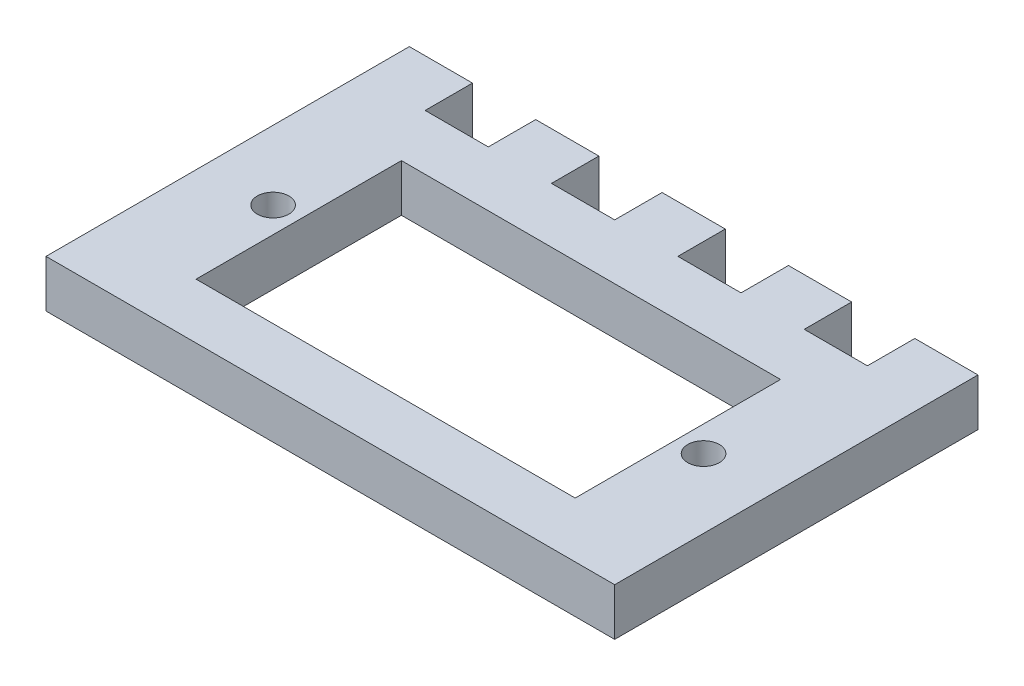
ISO-10303-21;
HEADER;
FILE_DESCRIPTION(('STEP AP214'),'2;1');
FILE_NAME('part.step','',(''),(''),'','','');
FILE_SCHEMA(('AUTOMOTIVE_DESIGN { 1 0 10303 214 1 1 1 1 }'));
ENDSEC;
DATA;
#1=APPLICATION_CONTEXT('core data for automotive mechanical design processes');
#2=APPLICATION_PROTOCOL_DEFINITION('international standard','automotive_design',2000,#1);
#3=PRODUCT_CONTEXT('',#1,'mechanical');
#4=PRODUCT('Part','Part','',(#3));
#5=PRODUCT_RELATED_PRODUCT_CATEGORY('part','',(#4));
#6=PRODUCT_DEFINITION_FORMATION('','',#4);
#7=PRODUCT_DEFINITION_CONTEXT('part definition',#1,'design');
#8=PRODUCT_DEFINITION('design','',#6,#7);
#9=PRODUCT_DEFINITION_SHAPE('','',#8);
#10=(LENGTH_UNIT() NAMED_UNIT(*) SI_UNIT(.MILLI.,.METRE.));
#11=(NAMED_UNIT(*) PLANE_ANGLE_UNIT() SI_UNIT($,.RADIAN.));
#12=(NAMED_UNIT(*) SI_UNIT($,.STERADIAN.) SOLID_ANGLE_UNIT());
#13=UNCERTAINTY_MEASURE_WITH_UNIT(LENGTH_MEASURE(1.E-05),#10,'distance_accuracy_value','');
#14=(GEOMETRIC_REPRESENTATION_CONTEXT(3) GLOBAL_UNCERTAINTY_ASSIGNED_CONTEXT((#13)) GLOBAL_UNIT_ASSIGNED_CONTEXT((#10,
#11,#12)) REPRESENTATION_CONTEXT('',''));
#15=CARTESIAN_POINT('',(0.,0.,0.));
#16=DIRECTION('',(0.,0.,1.));
#17=DIRECTION('',(1.,0.,0.));
#18=AXIS2_PLACEMENT_3D('',#15,#16,#17);
#19=CARTESIAN_POINT('',(0.,3.,0.));
#20=DIRECTION('',(0.,1.,0.));
#21=DIRECTION('',(0.,0.,1.));
#22=AXIS2_PLACEMENT_3D('',#19,#20,#21);
#23=PLANE('',#22);
#24=CARTESIAN_POINT('',(-13.625,3.,0.));
#25=DIRECTION('',(0.,1.,0.));
#26=DIRECTION('',(0.,0.,1.));
#27=AXIS2_PLACEMENT_3D('',#24,#25,#26);
#28=CIRCLE('',#27,1.);
#29=CARTESIAN_POINT('',(-13.625,3.,1.));
#30=VERTEX_POINT('',#29);
#31=EDGE_CURVE('E225',#30,#30,#28,.T.);
#32=ORIENTED_EDGE('',*,*,#31,.F.);
#33=EDGE_LOOP('',(#32));
#34=FACE_BOUND('',#33,.T.);
#35=DIRECTION('',(0.,0.,-1.));
#36=VECTOR('',#35,1.);
#37=CARTESIAN_POINT('',(18.,3.,-13.));
#38=LINE('',#37,#36);
#39=CARTESIAN_POINT('',(18.,3.,10.));
#40=VERTEX_POINT('',#39);
#41=CARTESIAN_POINT('',(18.,3.,-13.));
#42=VERTEX_POINT('',#41);
#43=EDGE_CURVE('E235',#40,#42,#38,.T.);
#44=ORIENTED_EDGE('',*,*,#43,.T.);
#45=DIRECTION('',(-1.,0.,0.));
#46=VECTOR('',#45,1.);
#47=CARTESIAN_POINT('',(14.,3.,-13.));
#48=LINE('',#47,#46);
#49=CARTESIAN_POINT('',(14.,3.,-13.));
#50=VERTEX_POINT('',#49);
#51=EDGE_CURVE('E238',#42,#50,#48,.T.);
#52=ORIENTED_EDGE('',*,*,#51,.T.);
#53=DIRECTION('',(0.,0.,1.));
#54=VECTOR('',#53,1.);
#55=CARTESIAN_POINT('',(14.,3.,-10.));
#56=LINE('',#55,#54);
#57=CARTESIAN_POINT('',(14.,3.,-10.));
#58=VERTEX_POINT('',#57);
#59=EDGE_CURVE('E241',#50,#58,#56,.T.);
#60=ORIENTED_EDGE('',*,*,#59,.T.);
#61=DIRECTION('',(-1.,0.,0.));
#62=VECTOR('',#61,1.);
#63=CARTESIAN_POINT('',(10.,3.,-10.));
#64=LINE('',#63,#62);
#65=CARTESIAN_POINT('',(10.,3.,-10.));
#66=VERTEX_POINT('',#65);
#67=EDGE_CURVE('E243',#58,#66,#64,.T.);
#68=ORIENTED_EDGE('',*,*,#67,.T.);
#69=DIRECTION('',(0.,0.,-1.));
#70=VECTOR('',#69,1.);
#71=CARTESIAN_POINT('',(10.,3.,-13.));
#72=LINE('',#71,#70);
#73=CARTESIAN_POINT('',(10.,3.,-13.));
#74=VERTEX_POINT('',#73);
#75=EDGE_CURVE('E245',#66,#74,#72,.T.);
#76=ORIENTED_EDGE('',*,*,#75,.T.);
#77=DIRECTION('',(-1.,0.,0.));
#78=VECTOR('',#77,1.);
#79=CARTESIAN_POINT('',(6.,3.,-13.));
#80=LINE('',#79,#78);
#81=CARTESIAN_POINT('',(6.,3.,-13.));
#82=VERTEX_POINT('',#81);
#83=EDGE_CURVE('E247',#74,#82,#80,.T.);
#84=ORIENTED_EDGE('',*,*,#83,.T.);
#85=DIRECTION('',(0.,0.,1.));
#86=VECTOR('',#85,1.);
#87=CARTESIAN_POINT('',(6.,3.,-10.));
#88=LINE('',#87,#86);
#89=CARTESIAN_POINT('',(6.,3.,-10.));
#90=VERTEX_POINT('',#89);
#91=EDGE_CURVE('E249',#82,#90,#88,.T.);
#92=ORIENTED_EDGE('',*,*,#91,.T.);
#93=DIRECTION('',(-1.,0.,0.));
#94=VECTOR('',#93,1.);
#95=CARTESIAN_POINT('',(2.,3.,-10.));
#96=LINE('',#95,#94);
#97=CARTESIAN_POINT('',(2.,3.,-10.));
#98=VERTEX_POINT('',#97);
#99=EDGE_CURVE('E251',#90,#98,#96,.T.);
#100=ORIENTED_EDGE('',*,*,#99,.T.);
#101=DIRECTION('',(0.,0.,-1.));
#102=VECTOR('',#101,1.);
#103=CARTESIAN_POINT('',(2.,3.,-13.));
#104=LINE('',#103,#102);
#105=CARTESIAN_POINT('',(2.,3.,-13.));
#106=VERTEX_POINT('',#105);
#107=EDGE_CURVE('E253',#98,#106,#104,.T.);
#108=ORIENTED_EDGE('',*,*,#107,.T.);
#109=DIRECTION('',(-1.,0.,0.));
#110=VECTOR('',#109,1.);
#111=CARTESIAN_POINT('',(-2.,3.,-13.));
#112=LINE('',#111,#110);
#113=CARTESIAN_POINT('',(-2.,3.,-13.));
#114=VERTEX_POINT('',#113);
#115=EDGE_CURVE('E255',#106,#114,#112,.T.);
#116=ORIENTED_EDGE('',*,*,#115,.T.);
#117=DIRECTION('',(0.,0.,1.));
#118=VECTOR('',#117,1.);
#119=CARTESIAN_POINT('',(-2.,3.,-10.));
#120=LINE('',#119,#118);
#121=CARTESIAN_POINT('',(-2.,3.,-10.));
#122=VERTEX_POINT('',#121);
#123=EDGE_CURVE('E257',#114,#122,#120,.T.);
#124=ORIENTED_EDGE('',*,*,#123,.T.);
#125=DIRECTION('',(-1.,0.,0.));
#126=VECTOR('',#125,1.);
#127=CARTESIAN_POINT('',(-6.,3.,-10.));
#128=LINE('',#127,#126);
#129=CARTESIAN_POINT('',(-6.,3.,-10.));
#130=VERTEX_POINT('',#129);
#131=EDGE_CURVE('E259',#122,#130,#128,.T.);
#132=ORIENTED_EDGE('',*,*,#131,.T.);
#133=DIRECTION('',(0.,0.,-1.));
#134=VECTOR('',#133,1.);
#135=CARTESIAN_POINT('',(-6.,3.,-13.));
#136=LINE('',#135,#134);
#137=CARTESIAN_POINT('',(-6.,3.,-13.));
#138=VERTEX_POINT('',#137);
#139=EDGE_CURVE('E261',#130,#138,#136,.T.);
#140=ORIENTED_EDGE('',*,*,#139,.T.);
#141=DIRECTION('',(-1.,0.,0.));
#142=VECTOR('',#141,1.);
#143=CARTESIAN_POINT('',(-9.99999999999999,3.,-13.));
#144=LINE('',#143,#142);
#145=CARTESIAN_POINT('',(-9.99999999999999,3.,-13.));
#146=VERTEX_POINT('',#145);
#147=EDGE_CURVE('E263',#138,#146,#144,.T.);
#148=ORIENTED_EDGE('',*,*,#147,.T.);
#149=DIRECTION('',(0.,0.,1.));
#150=VECTOR('',#149,1.);
#151=CARTESIAN_POINT('',(-9.99999999999999,3.,-10.));
#152=LINE('',#151,#150);
#153=CARTESIAN_POINT('',(-9.99999999999999,3.,-10.));
#154=VERTEX_POINT('',#153);
#155=EDGE_CURVE('E265',#146,#154,#152,.T.);
#156=ORIENTED_EDGE('',*,*,#155,.T.);
#157=DIRECTION('',(-1.,0.,0.));
#158=VECTOR('',#157,1.);
#159=CARTESIAN_POINT('',(-14.,3.,-10.));
#160=LINE('',#159,#158);
#161=CARTESIAN_POINT('',(-14.,3.,-10.));
#162=VERTEX_POINT('',#161);
#163=EDGE_CURVE('E267',#154,#162,#160,.T.);
#164=ORIENTED_EDGE('',*,*,#163,.T.);
#165=DIRECTION('',(0.,0.,-1.));
#166=VECTOR('',#165,1.);
#167=CARTESIAN_POINT('',(-14.,3.,-13.));
#168=LINE('',#167,#166);
#169=CARTESIAN_POINT('',(-14.,3.,-13.));
#170=VERTEX_POINT('',#169);
#171=EDGE_CURVE('E269',#162,#170,#168,.T.);
#172=ORIENTED_EDGE('',*,*,#171,.T.);
#173=DIRECTION('',(-1.,0.,0.));
#174=VECTOR('',#173,1.);
#175=CARTESIAN_POINT('',(-18.,3.,-13.));
#176=LINE('',#175,#174);
#177=CARTESIAN_POINT('',(-18.,3.,-13.));
#178=VERTEX_POINT('',#177);
#179=EDGE_CURVE('E271',#170,#178,#176,.T.);
#180=ORIENTED_EDGE('',*,*,#179,.T.);
#181=DIRECTION('',(0.,0.,1.));
#182=VECTOR('',#181,1.);
#183=CARTESIAN_POINT('',(-18.,3.,-10.));
#184=LINE('',#183,#182);
#185=CARTESIAN_POINT('',(-18.,3.,10.));
#186=VERTEX_POINT('',#185);
#187=EDGE_CURVE('E273',#178,#186,#184,.T.);
#188=ORIENTED_EDGE('',*,*,#187,.T.);
#189=DIRECTION('',(1.,0.,0.));
#190=VECTOR('',#189,1.);
#191=CARTESIAN_POINT('',(-18.,3.,10.));
#192=LINE('',#191,#190);
#193=EDGE_CURVE('E275',#186,#40,#192,.T.);
#194=ORIENTED_EDGE('',*,*,#193,.T.);
#195=EDGE_LOOP('',(#44,#52,#60,#68,#76,#84,#92,#100,#108,#116,#124,#132,#140,#148,#156,#164,
#172,#180,#188,#194));
#196=FACE_BOUND('',#195,.T.);
#197=DIRECTION('',(-1.,0.,0.));
#198=VECTOR('',#197,1.);
#199=CARTESIAN_POINT('',(-12.,3.,-6.5));
#200=LINE('',#199,#198);
#201=CARTESIAN_POINT('',(12.,3.,-6.5));
#202=VERTEX_POINT('',#201);
#203=CARTESIAN_POINT('',(-12.,3.,-6.5));
#204=VERTEX_POINT('',#203);
#205=EDGE_CURVE('E204',#202,#204,#200,.T.);
#206=ORIENTED_EDGE('',*,*,#205,.F.);
#207=DIRECTION('',(0.,0.,-1.));
#208=VECTOR('',#207,1.);
#209=CARTESIAN_POINT('',(12.,3.,6.5));
#210=LINE('',#209,#208);
#211=CARTESIAN_POINT('',(12.,3.,6.5));
#212=VERTEX_POINT('',#211);
#213=EDGE_CURVE('E196',#212,#202,#210,.T.);
#214=ORIENTED_EDGE('',*,*,#213,.F.);
#215=DIRECTION('',(1.,0.,0.));
#216=VECTOR('',#215,1.);
#217=CARTESIAN_POINT('',(-12.,3.,6.5));
#218=LINE('',#217,#216);
#219=CARTESIAN_POINT('',(-12.,3.,6.5));
#220=VERTEX_POINT('',#219);
#221=EDGE_CURVE('E219',#220,#212,#218,.T.);
#222=ORIENTED_EDGE('',*,*,#221,.F.);
#223=DIRECTION('',(0.,0.,1.));
#224=VECTOR('',#223,1.);
#225=CARTESIAN_POINT('',(-12.,3.,6.5));
#226=LINE('',#225,#224);
#227=EDGE_CURVE('E217',#204,#220,#226,.T.);
#228=ORIENTED_EDGE('',*,*,#227,.F.);
#229=EDGE_LOOP('',(#206,#214,#222,#228));
#230=FACE_BOUND('',#229,.T.);
#231=CARTESIAN_POINT('',(13.625,3.,0.));
#232=DIRECTION('',(0.,1.,0.));
#233=DIRECTION('',(0.,0.,-1.));
#234=AXIS2_PLACEMENT_3D('',#231,#232,#233);
#235=CIRCLE('',#234,1.);
#236=CARTESIAN_POINT('',(13.625,3.,-1.));
#237=VERTEX_POINT('',#236);
#238=EDGE_CURVE('E712',#237,#237,#235,.T.);
#239=ORIENTED_EDGE('',*,*,#238,.F.);
#240=EDGE_LOOP('',(#239));
#241=FACE_BOUND('',#240,.T.);
#242=ADVANCED_FACE('F35',(#34,#196,#230,#241),#23,.T.);
#243=CARTESIAN_POINT('',(0.,0.,0.));
#244=DIRECTION('',(0.,1.,0.));
#245=DIRECTION('',(0.,0.,1.));
#246=AXIS2_PLACEMENT_3D('',#243,#244,#245);
#247=PLANE('',#246);
#248=CARTESIAN_POINT('',(-13.625,0.,0.));
#249=DIRECTION('',(0.,1.,0.));
#250=DIRECTION('',(0.,0.,1.));
#251=AXIS2_PLACEMENT_3D('',#248,#249,#250);
#252=CIRCLE('',#251,1.);
#253=CARTESIAN_POINT('',(-13.625,0.,1.));
#254=VERTEX_POINT('',#253);
#255=EDGE_CURVE('E718',#254,#254,#252,.T.);
#256=ORIENTED_EDGE('',*,*,#255,.T.);
#257=EDGE_LOOP('',(#256));
#258=FACE_BOUND('',#257,.T.);
#259=DIRECTION('',(-1.,0.,0.));
#260=VECTOR('',#259,1.);
#261=CARTESIAN_POINT('',(14.,0.,-13.));
#262=LINE('',#261,#260);
#263=CARTESIAN_POINT('',(18.,0.,-13.));
#264=VERTEX_POINT('',#263);
#265=CARTESIAN_POINT('',(14.,0.,-13.));
#266=VERTEX_POINT('',#265);
#267=EDGE_CURVE('E212',#264,#266,#262,.T.);
#268=ORIENTED_EDGE('',*,*,#267,.F.);
#269=DIRECTION('',(0.,0.,-1.));
#270=VECTOR('',#269,1.);
#271=CARTESIAN_POINT('',(18.,0.,10.));
#272=LINE('',#271,#270);
#273=CARTESIAN_POINT('',(18.,0.,10.));
#274=VERTEX_POINT('',#273);
#275=EDGE_CURVE('E239',#274,#264,#272,.T.);
#276=ORIENTED_EDGE('',*,*,#275,.F.);
#277=DIRECTION('',(1.,0.,0.));
#278=VECTOR('',#277,1.);
#279=CARTESIAN_POINT('',(-18.,0.,10.));
#280=LINE('',#279,#278);
#281=CARTESIAN_POINT('',(-18.,0.,10.));
#282=VERTEX_POINT('',#281);
#283=EDGE_CURVE('E315',#282,#274,#280,.T.);
#284=ORIENTED_EDGE('',*,*,#283,.F.);
#285=DIRECTION('',(0.,0.,1.));
#286=VECTOR('',#285,1.);
#287=CARTESIAN_POINT('',(-18.,0.,10.));
#288=LINE('',#287,#286);
#289=CARTESIAN_POINT('',(-18.,0.,-13.));
#290=VERTEX_POINT('',#289);
#291=EDGE_CURVE('E313',#290,#282,#288,.T.);
#292=ORIENTED_EDGE('',*,*,#291,.F.);
#293=DIRECTION('',(-1.,0.,0.));
#294=VECTOR('',#293,1.);
#295=CARTESIAN_POINT('',(-18.,0.,-13.));
#296=LINE('',#295,#294);
#297=CARTESIAN_POINT('',(-14.,0.,-13.));
#298=VERTEX_POINT('',#297);
#299=EDGE_CURVE('E310',#298,#290,#296,.T.);
#300=ORIENTED_EDGE('',*,*,#299,.F.);
#301=DIRECTION('',(0.,0.,-1.));
#302=VECTOR('',#301,1.);
#303=CARTESIAN_POINT('',(-14.,0.,-13.));
#304=LINE('',#303,#302);
#305=CARTESIAN_POINT('',(-14.,0.,-10.));
#306=VERTEX_POINT('',#305);
#307=EDGE_CURVE('E308',#306,#298,#304,.T.);
#308=ORIENTED_EDGE('',*,*,#307,.F.);
#309=DIRECTION('',(-1.,0.,0.));
#310=VECTOR('',#309,1.);
#311=CARTESIAN_POINT('',(-14.,0.,-10.));
#312=LINE('',#311,#310);
#313=CARTESIAN_POINT('',(-9.99999999999999,0.,-10.));
#314=VERTEX_POINT('',#313);
#315=EDGE_CURVE('E306',#314,#306,#312,.T.);
#316=ORIENTED_EDGE('',*,*,#315,.F.);
#317=DIRECTION('',(0.,0.,1.));
#318=VECTOR('',#317,1.);
#319=CARTESIAN_POINT('',(-9.99999999999999,0.,-10.));
#320=LINE('',#319,#318);
#321=CARTESIAN_POINT('',(-9.99999999999999,0.,-13.));
#322=VERTEX_POINT('',#321);
#323=EDGE_CURVE('E304',#322,#314,#320,.T.);
#324=ORIENTED_EDGE('',*,*,#323,.F.);
#325=DIRECTION('',(-1.,0.,0.));
#326=VECTOR('',#325,1.);
#327=CARTESIAN_POINT('',(-9.99999999999999,0.,-13.));
#328=LINE('',#327,#326);
#329=CARTESIAN_POINT('',(-6.,0.,-13.));
#330=VERTEX_POINT('',#329);
#331=EDGE_CURVE('E302',#330,#322,#328,.T.);
#332=ORIENTED_EDGE('',*,*,#331,.F.);
#333=DIRECTION('',(0.,0.,-1.));
#334=VECTOR('',#333,1.);
#335=CARTESIAN_POINT('',(-6.,0.,-13.));
#336=LINE('',#335,#334);
#337=CARTESIAN_POINT('',(-6.,0.,-10.));
#338=VERTEX_POINT('',#337);
#339=EDGE_CURVE('E300',#338,#330,#336,.T.);
#340=ORIENTED_EDGE('',*,*,#339,.F.);
#341=DIRECTION('',(-1.,0.,0.));
#342=VECTOR('',#341,1.);
#343=CARTESIAN_POINT('',(-6.,0.,-10.));
#344=LINE('',#343,#342);
#345=CARTESIAN_POINT('',(-2.,0.,-10.));
#346=VERTEX_POINT('',#345);
#347=EDGE_CURVE('E298',#346,#338,#344,.T.);
#348=ORIENTED_EDGE('',*,*,#347,.F.);
#349=DIRECTION('',(0.,0.,1.));
#350=VECTOR('',#349,1.);
#351=CARTESIAN_POINT('',(-2.,0.,-10.));
#352=LINE('',#351,#350);
#353=CARTESIAN_POINT('',(-2.,0.,-13.));
#354=VERTEX_POINT('',#353);
#355=EDGE_CURVE('E296',#354,#346,#352,.T.);
#356=ORIENTED_EDGE('',*,*,#355,.F.);
#357=DIRECTION('',(-1.,0.,0.));
#358=VECTOR('',#357,1.);
#359=CARTESIAN_POINT('',(-2.,0.,-13.));
#360=LINE('',#359,#358);
#361=CARTESIAN_POINT('',(2.,0.,-13.));
#362=VERTEX_POINT('',#361);
#363=EDGE_CURVE('E294',#362,#354,#360,.T.);
#364=ORIENTED_EDGE('',*,*,#363,.F.);
#365=DIRECTION('',(0.,0.,-1.));
#366=VECTOR('',#365,1.);
#367=CARTESIAN_POINT('',(2.,0.,-13.));
#368=LINE('',#367,#366);
#369=CARTESIAN_POINT('',(2.,0.,-10.));
#370=VERTEX_POINT('',#369);
#371=EDGE_CURVE('E292',#370,#362,#368,.T.);
#372=ORIENTED_EDGE('',*,*,#371,.F.);
#373=DIRECTION('',(-1.,0.,0.));
#374=VECTOR('',#373,1.);
#375=CARTESIAN_POINT('',(2.,0.,-10.));
#376=LINE('',#375,#374);
#377=CARTESIAN_POINT('',(6.,0.,-10.));
#378=VERTEX_POINT('',#377);
#379=EDGE_CURVE('E290',#378,#370,#376,.T.);
#380=ORIENTED_EDGE('',*,*,#379,.F.);
#381=DIRECTION('',(0.,0.,1.));
#382=VECTOR('',#381,1.);
#383=CARTESIAN_POINT('',(6.,0.,-10.));
#384=LINE('',#383,#382);
#385=CARTESIAN_POINT('',(6.,0.,-13.));
#386=VERTEX_POINT('',#385);
#387=EDGE_CURVE('E288',#386,#378,#384,.T.);
#388=ORIENTED_EDGE('',*,*,#387,.F.);
#389=DIRECTION('',(-1.,0.,0.));
#390=VECTOR('',#389,1.);
#391=CARTESIAN_POINT('',(6.,0.,-13.));
#392=LINE('',#391,#390);
#393=CARTESIAN_POINT('',(10.,0.,-13.));
#394=VERTEX_POINT('',#393);
#395=EDGE_CURVE('E286',#394,#386,#392,.T.);
#396=ORIENTED_EDGE('',*,*,#395,.F.);
#397=DIRECTION('',(0.,0.,-1.));
#398=VECTOR('',#397,1.);
#399=CARTESIAN_POINT('',(10.,0.,-13.));
#400=LINE('',#399,#398);
#401=CARTESIAN_POINT('',(10.,0.,-10.));
#402=VERTEX_POINT('',#401);
#403=EDGE_CURVE('E284',#402,#394,#400,.T.);
#404=ORIENTED_EDGE('',*,*,#403,.F.);
#405=DIRECTION('',(-1.,0.,0.));
#406=VECTOR('',#405,1.);
#407=CARTESIAN_POINT('',(10.,0.,-10.));
#408=LINE('',#407,#406);
#409=CARTESIAN_POINT('',(14.,0.,-10.));
#410=VERTEX_POINT('',#409);
#411=EDGE_CURVE('E282',#410,#402,#408,.T.);
#412=ORIENTED_EDGE('',*,*,#411,.F.);
#413=DIRECTION('',(0.,0.,1.));
#414=VECTOR('',#413,1.);
#415=CARTESIAN_POINT('',(14.,0.,-10.));
#416=LINE('',#415,#414);
#417=EDGE_CURVE('E280',#266,#410,#416,.T.);
#418=ORIENTED_EDGE('',*,*,#417,.F.);
#419=EDGE_LOOP('',(#268,#276,#284,#292,#300,#308,#316,#324,#332,#340,#348,#356,#364,#372,#380,
#388,#396,#404,#412,#418));
#420=FACE_BOUND('',#419,.T.);
#421=DIRECTION('',(0.,0.,-1.));
#422=VECTOR('',#421,1.);
#423=CARTESIAN_POINT('',(12.,0.,6.5));
#424=LINE('',#423,#422);
#425=CARTESIAN_POINT('',(12.,0.,6.5));
#426=VERTEX_POINT('',#425);
#427=CARTESIAN_POINT('',(12.,0.,-6.5));
#428=VERTEX_POINT('',#427);
#429=EDGE_CURVE('E58',#426,#428,#424,.T.);
#430=ORIENTED_EDGE('',*,*,#429,.T.);
#431=DIRECTION('',(-1.,0.,0.));
#432=VECTOR('',#431,1.);
#433=CARTESIAN_POINT('',(-12.,0.,-6.5));
#434=LINE('',#433,#432);
#435=CARTESIAN_POINT('',(-12.,0.,-6.5));
#436=VERTEX_POINT('',#435);
#437=EDGE_CURVE('E211',#428,#436,#434,.T.);
#438=ORIENTED_EDGE('',*,*,#437,.T.);
#439=DIRECTION('',(0.,0.,1.));
#440=VECTOR('',#439,1.);
#441=CARTESIAN_POINT('',(-12.,0.,6.5));
#442=LINE('',#441,#440);
#443=CARTESIAN_POINT('',(-12.,0.,6.5));
#444=VERTEX_POINT('',#443);
#445=EDGE_CURVE('E227',#436,#444,#442,.T.);
#446=ORIENTED_EDGE('',*,*,#445,.T.);
#447=DIRECTION('',(1.,0.,0.));
#448=VECTOR('',#447,1.);
#449=CARTESIAN_POINT('',(-12.,0.,6.5));
#450=LINE('',#449,#448);
#451=EDGE_CURVE('E205',#444,#426,#450,.T.);
#452=ORIENTED_EDGE('',*,*,#451,.T.);
#453=EDGE_LOOP('',(#430,#438,#446,#452));
#454=FACE_BOUND('',#453,.T.);
#455=CARTESIAN_POINT('',(13.625,0.,0.));
#456=DIRECTION('',(0.,1.,0.));
#457=DIRECTION('',(0.,0.,-1.));
#458=AXIS2_PLACEMENT_3D('',#455,#456,#457);
#459=CIRCLE('',#458,1.);
#460=CARTESIAN_POINT('',(13.625,0.,-1.));
#461=VERTEX_POINT('',#460);
#462=EDGE_CURVE('E715',#461,#461,#459,.T.);
#463=ORIENTED_EDGE('',*,*,#462,.T.);
#464=EDGE_LOOP('',(#463));
#465=FACE_BOUND('',#464,.T.);
#466=ADVANCED_FACE('F381',(#258,#420,#454,#465),#247,.F.);
#467=CARTESIAN_POINT('',(14.,3.,-13.));
#468=DIRECTION('',(0.,0.,1.));
#469=DIRECTION('',(1.,0.,0.));
#470=AXIS2_PLACEMENT_3D('',#467,#468,#469);
#471=PLANE('',#470);
#472=ORIENTED_EDGE('',*,*,#267,.T.);
#473=DIRECTION('',(0.,-1.,0.));
#474=VECTOR('',#473,1.);
#475=CARTESIAN_POINT('',(14.,3.,-13.));
#476=LINE('',#475,#474);
#477=EDGE_CURVE('E43',#50,#266,#476,.T.);
#478=ORIENTED_EDGE('',*,*,#477,.F.);
#479=ORIENTED_EDGE('',*,*,#51,.F.);
#480=DIRECTION('',(0.,-1.,0.));
#481=VECTOR('',#480,1.);
#482=CARTESIAN_POINT('',(18.,3.,-13.));
#483=LINE('',#482,#481);
#484=EDGE_CURVE('E11',#42,#264,#483,.T.);
#485=ORIENTED_EDGE('',*,*,#484,.T.);
#486=EDGE_LOOP('',(#472,#478,#479,#485));
#487=FACE_BOUND('',#486,.T.);
#488=ADVANCED_FACE('F37',(#487),#471,.F.);
#489=CARTESIAN_POINT('',(14.,3.,-10.));
#490=DIRECTION('',(1.,0.,0.));
#491=DIRECTION('',(0.,0.,-1.));
#492=AXIS2_PLACEMENT_3D('',#489,#490,#491);
#493=PLANE('',#492);
#494=ORIENTED_EDGE('',*,*,#417,.T.);
#495=DIRECTION('',(0.,-1.,0.));
#496=VECTOR('',#495,1.);
#497=CARTESIAN_POINT('',(14.,3.,-10.));
#498=LINE('',#497,#496);
#499=EDGE_CURVE('E368',#58,#410,#498,.T.);
#500=ORIENTED_EDGE('',*,*,#499,.F.);
#501=ORIENTED_EDGE('',*,*,#59,.F.);
#502=ORIENTED_EDGE('',*,*,#477,.T.);
#503=EDGE_LOOP('',(#494,#500,#501,#502));
#504=FACE_BOUND('',#503,.T.);
#505=ADVANCED_FACE('F375',(#504),#493,.F.);
#506=CARTESIAN_POINT('',(10.,3.,-10.));
#507=DIRECTION('',(0.,0.,1.));
#508=DIRECTION('',(1.,0.,0.));
#509=AXIS2_PLACEMENT_3D('',#506,#507,#508);
#510=PLANE('',#509);
#511=ORIENTED_EDGE('',*,*,#411,.T.);
#512=DIRECTION('',(0.,-1.,0.));
#513=VECTOR('',#512,1.);
#514=CARTESIAN_POINT('',(10.,3.,-10.));
#515=LINE('',#514,#513);
#516=EDGE_CURVE('E365',#66,#402,#515,.T.);
#517=ORIENTED_EDGE('',*,*,#516,.F.);
#518=ORIENTED_EDGE('',*,*,#67,.F.);
#519=ORIENTED_EDGE('',*,*,#499,.T.);
#520=EDGE_LOOP('',(#511,#517,#518,#519));
#521=FACE_BOUND('',#520,.T.);
#522=ADVANCED_FACE('F388',(#521),#510,.F.);
#523=CARTESIAN_POINT('',(10.,3.,-13.));
#524=DIRECTION('',(-1.,0.,0.));
#525=DIRECTION('',(0.,0.,1.));
#526=AXIS2_PLACEMENT_3D('',#523,#524,#525);
#527=PLANE('',#526);
#528=ORIENTED_EDGE('',*,*,#403,.T.);
#529=DIRECTION('',(0.,-1.,0.));
#530=VECTOR('',#529,1.);
#531=CARTESIAN_POINT('',(10.,3.,-13.));
#532=LINE('',#531,#530);
#533=EDGE_CURVE('E362',#74,#394,#532,.T.);
#534=ORIENTED_EDGE('',*,*,#533,.F.);
#535=ORIENTED_EDGE('',*,*,#75,.F.);
#536=ORIENTED_EDGE('',*,*,#516,.T.);
#537=EDGE_LOOP('',(#528,#534,#535,#536));
#538=FACE_BOUND('',#537,.T.);
#539=ADVANCED_FACE('F392',(#538),#527,.F.);
#540=CARTESIAN_POINT('',(6.,3.,-13.));
#541=DIRECTION('',(0.,0.,1.));
#542=DIRECTION('',(1.,0.,0.));
#543=AXIS2_PLACEMENT_3D('',#540,#541,#542);
#544=PLANE('',#543);
#545=ORIENTED_EDGE('',*,*,#395,.T.);
#546=DIRECTION('',(0.,-1.,0.));
#547=VECTOR('',#546,1.);
#548=CARTESIAN_POINT('',(6.,3.,-13.));
#549=LINE('',#548,#547);
#550=EDGE_CURVE('E359',#82,#386,#549,.T.);
#551=ORIENTED_EDGE('',*,*,#550,.F.);
#552=ORIENTED_EDGE('',*,*,#83,.F.);
#553=ORIENTED_EDGE('',*,*,#533,.T.);
#554=EDGE_LOOP('',(#545,#551,#552,#553));
#555=FACE_BOUND('',#554,.T.);
#556=ADVANCED_FACE('F470',(#555),#544,.F.);
#557=CARTESIAN_POINT('',(6.,3.,-10.));
#558=DIRECTION('',(1.,0.,0.));
#559=DIRECTION('',(0.,0.,-1.));
#560=AXIS2_PLACEMENT_3D('',#557,#558,#559);
#561=PLANE('',#560);
#562=ORIENTED_EDGE('',*,*,#387,.T.);
#563=DIRECTION('',(0.,-1.,0.));
#564=VECTOR('',#563,1.);
#565=CARTESIAN_POINT('',(6.,3.,-10.));
#566=LINE('',#565,#564);
#567=EDGE_CURVE('E356',#90,#378,#566,.T.);
#568=ORIENTED_EDGE('',*,*,#567,.F.);
#569=ORIENTED_EDGE('',*,*,#91,.F.);
#570=ORIENTED_EDGE('',*,*,#550,.T.);
#571=EDGE_LOOP('',(#562,#568,#569,#570));
#572=FACE_BOUND('',#571,.T.);
#573=ADVANCED_FACE('F468',(#572),#561,.F.);
#574=CARTESIAN_POINT('',(2.,3.,-10.));
#575=DIRECTION('',(0.,0.,1.));
#576=DIRECTION('',(1.,0.,0.));
#577=AXIS2_PLACEMENT_3D('',#574,#575,#576);
#578=PLANE('',#577);
#579=ORIENTED_EDGE('',*,*,#379,.T.);
#580=DIRECTION('',(0.,-1.,0.));
#581=VECTOR('',#580,1.);
#582=CARTESIAN_POINT('',(2.,3.,-10.));
#583=LINE('',#582,#581);
#584=EDGE_CURVE('E353',#98,#370,#583,.T.);
#585=ORIENTED_EDGE('',*,*,#584,.F.);
#586=ORIENTED_EDGE('',*,*,#99,.F.);
#587=ORIENTED_EDGE('',*,*,#567,.T.);
#588=EDGE_LOOP('',(#579,#585,#586,#587));
#589=FACE_BOUND('',#588,.T.);
#590=ADVANCED_FACE('F463',(#589),#578,.F.);
#591=CARTESIAN_POINT('',(2.,3.,-13.));
#592=DIRECTION('',(-1.,0.,0.));
#593=DIRECTION('',(0.,0.,1.));
#594=AXIS2_PLACEMENT_3D('',#591,#592,#593);
#595=PLANE('',#594);
#596=ORIENTED_EDGE('',*,*,#371,.T.);
#597=DIRECTION('',(0.,-1.,0.));
#598=VECTOR('',#597,1.);
#599=CARTESIAN_POINT('',(2.,3.,-13.));
#600=LINE('',#599,#598);
#601=EDGE_CURVE('E350',#106,#362,#600,.T.);
#602=ORIENTED_EDGE('',*,*,#601,.F.);
#603=ORIENTED_EDGE('',*,*,#107,.F.);
#604=ORIENTED_EDGE('',*,*,#584,.T.);
#605=EDGE_LOOP('',(#596,#602,#603,#604));
#606=FACE_BOUND('',#605,.T.);
#607=ADVANCED_FACE('F458',(#606),#595,.F.);
#608=CARTESIAN_POINT('',(-2.,3.,-13.));
#609=DIRECTION('',(0.,0.,1.));
#610=DIRECTION('',(1.,0.,0.));
#611=AXIS2_PLACEMENT_3D('',#608,#609,#610);
#612=PLANE('',#611);
#613=ORIENTED_EDGE('',*,*,#363,.T.);
#614=DIRECTION('',(0.,-1.,0.));
#615=VECTOR('',#614,1.);
#616=CARTESIAN_POINT('',(-2.,3.,-13.));
#617=LINE('',#616,#615);
#618=EDGE_CURVE('E347',#114,#354,#617,.T.);
#619=ORIENTED_EDGE('',*,*,#618,.F.);
#620=ORIENTED_EDGE('',*,*,#115,.F.);
#621=ORIENTED_EDGE('',*,*,#601,.T.);
#622=EDGE_LOOP('',(#613,#619,#620,#621));
#623=FACE_BOUND('',#622,.T.);
#624=ADVANCED_FACE('F454',(#623),#612,.F.);
#625=CARTESIAN_POINT('',(-2.,3.,-10.));
#626=DIRECTION('',(1.,0.,0.));
#627=DIRECTION('',(0.,0.,-1.));
#628=AXIS2_PLACEMENT_3D('',#625,#626,#627);
#629=PLANE('',#628);
#630=ORIENTED_EDGE('',*,*,#355,.T.);
#631=DIRECTION('',(0.,-1.,0.));
#632=VECTOR('',#631,1.);
#633=CARTESIAN_POINT('',(-2.,3.,-10.));
#634=LINE('',#633,#632);
#635=EDGE_CURVE('E344',#122,#346,#634,.T.);
#636=ORIENTED_EDGE('',*,*,#635,.F.);
#637=ORIENTED_EDGE('',*,*,#123,.F.);
#638=ORIENTED_EDGE('',*,*,#618,.T.);
#639=EDGE_LOOP('',(#630,#636,#637,#638));
#640=FACE_BOUND('',#639,.T.);
#641=ADVANCED_FACE('F449',(#640),#629,.F.);
#642=CARTESIAN_POINT('',(-6.,3.,-10.));
#643=DIRECTION('',(0.,0.,1.));
#644=DIRECTION('',(1.,0.,0.));
#645=AXIS2_PLACEMENT_3D('',#642,#643,#644);
#646=PLANE('',#645);
#647=ORIENTED_EDGE('',*,*,#347,.T.);
#648=DIRECTION('',(0.,-1.,0.));
#649=VECTOR('',#648,1.);
#650=CARTESIAN_POINT('',(-6.,3.,-10.));
#651=LINE('',#650,#649);
#652=EDGE_CURVE('E341',#130,#338,#651,.T.);
#653=ORIENTED_EDGE('',*,*,#652,.F.);
#654=ORIENTED_EDGE('',*,*,#131,.F.);
#655=ORIENTED_EDGE('',*,*,#635,.T.);
#656=EDGE_LOOP('',(#647,#653,#654,#655));
#657=FACE_BOUND('',#656,.T.);
#658=ADVANCED_FACE('F443',(#657),#646,.F.);
#659=CARTESIAN_POINT('',(-6.,3.,-13.));
#660=DIRECTION('',(-1.,0.,0.));
#661=DIRECTION('',(0.,0.,1.));
#662=AXIS2_PLACEMENT_3D('',#659,#660,#661);
#663=PLANE('',#662);
#664=ORIENTED_EDGE('',*,*,#339,.T.);
#665=DIRECTION('',(0.,-1.,0.));
#666=VECTOR('',#665,1.);
#667=CARTESIAN_POINT('',(-6.,3.,-13.));
#668=LINE('',#667,#666);
#669=EDGE_CURVE('E338',#138,#330,#668,.T.);
#670=ORIENTED_EDGE('',*,*,#669,.F.);
#671=ORIENTED_EDGE('',*,*,#139,.F.);
#672=ORIENTED_EDGE('',*,*,#652,.T.);
#673=EDGE_LOOP('',(#664,#670,#671,#672));
#674=FACE_BOUND('',#673,.T.);
#675=ADVANCED_FACE('F439',(#674),#663,.F.);
#676=CARTESIAN_POINT('',(-9.99999999999999,3.,-13.));
#677=DIRECTION('',(0.,0.,1.));
#678=DIRECTION('',(1.,0.,0.));
#679=AXIS2_PLACEMENT_3D('',#676,#677,#678);
#680=PLANE('',#679);
#681=ORIENTED_EDGE('',*,*,#331,.T.);
#682=DIRECTION('',(0.,-1.,0.));
#683=VECTOR('',#682,1.);
#684=CARTESIAN_POINT('',(-9.99999999999999,3.,-13.));
#685=LINE('',#684,#683);
#686=EDGE_CURVE('E335',#146,#322,#685,.T.);
#687=ORIENTED_EDGE('',*,*,#686,.F.);
#688=ORIENTED_EDGE('',*,*,#147,.F.);
#689=ORIENTED_EDGE('',*,*,#669,.T.);
#690=EDGE_LOOP('',(#681,#687,#688,#689));
#691=FACE_BOUND('',#690,.T.);
#692=ADVANCED_FACE('F434',(#691),#680,.F.);
#693=CARTESIAN_POINT('',(-9.99999999999999,3.,-10.));
#694=DIRECTION('',(1.,0.,0.));
#695=DIRECTION('',(0.,0.,-1.));
#696=AXIS2_PLACEMENT_3D('',#693,#694,#695);
#697=PLANE('',#696);
#698=ORIENTED_EDGE('',*,*,#323,.T.);
#699=DIRECTION('',(0.,-1.,0.));
#700=VECTOR('',#699,1.);
#701=CARTESIAN_POINT('',(-9.99999999999999,3.,-10.));
#702=LINE('',#701,#700);
#703=EDGE_CURVE('E332',#154,#314,#702,.T.);
#704=ORIENTED_EDGE('',*,*,#703,.F.);
#705=ORIENTED_EDGE('',*,*,#155,.F.);
#706=ORIENTED_EDGE('',*,*,#686,.T.);
#707=EDGE_LOOP('',(#698,#704,#705,#706));
#708=FACE_BOUND('',#707,.T.);
#709=ADVANCED_FACE('F428',(#708),#697,.F.);
#710=CARTESIAN_POINT('',(-14.,3.,-10.));
#711=DIRECTION('',(0.,0.,1.));
#712=DIRECTION('',(1.,0.,0.));
#713=AXIS2_PLACEMENT_3D('',#710,#711,#712);
#714=PLANE('',#713);
#715=ORIENTED_EDGE('',*,*,#315,.T.);
#716=DIRECTION('',(0.,-1.,0.));
#717=VECTOR('',#716,1.);
#718=CARTESIAN_POINT('',(-14.,3.,-10.));
#719=LINE('',#718,#717);
#720=EDGE_CURVE('E329',#162,#306,#719,.T.);
#721=ORIENTED_EDGE('',*,*,#720,.F.);
#722=ORIENTED_EDGE('',*,*,#163,.F.);
#723=ORIENTED_EDGE('',*,*,#703,.T.);
#724=EDGE_LOOP('',(#715,#721,#722,#723));
#725=FACE_BOUND('',#724,.T.);
#726=ADVANCED_FACE('F424',(#725),#714,.F.);
#727=CARTESIAN_POINT('',(-14.,3.,-13.));
#728=DIRECTION('',(-1.,0.,0.));
#729=DIRECTION('',(0.,0.,1.));
#730=AXIS2_PLACEMENT_3D('',#727,#728,#729);
#731=PLANE('',#730);
#732=ORIENTED_EDGE('',*,*,#307,.T.);
#733=DIRECTION('',(0.,-1.,0.));
#734=VECTOR('',#733,1.);
#735=CARTESIAN_POINT('',(-14.,3.,-13.));
#736=LINE('',#735,#734);
#737=EDGE_CURVE('E326',#170,#298,#736,.T.);
#738=ORIENTED_EDGE('',*,*,#737,.F.);
#739=ORIENTED_EDGE('',*,*,#171,.F.);
#740=ORIENTED_EDGE('',*,*,#720,.T.);
#741=EDGE_LOOP('',(#732,#738,#739,#740));
#742=FACE_BOUND('',#741,.T.);
#743=ADVANCED_FACE('F419',(#742),#731,.F.);
#744=CARTESIAN_POINT('',(-18.,3.,-13.));
#745=DIRECTION('',(0.,0.,1.));
#746=DIRECTION('',(1.,0.,0.));
#747=AXIS2_PLACEMENT_3D('',#744,#745,#746);
#748=PLANE('',#747);
#749=ORIENTED_EDGE('',*,*,#299,.T.);
#750=DIRECTION('',(0.,-1.,0.));
#751=VECTOR('',#750,1.);
#752=CARTESIAN_POINT('',(-18.,3.,-13.));
#753=LINE('',#752,#751);
#754=EDGE_CURVE('E323',#178,#290,#753,.T.);
#755=ORIENTED_EDGE('',*,*,#754,.F.);
#756=ORIENTED_EDGE('',*,*,#179,.F.);
#757=ORIENTED_EDGE('',*,*,#737,.T.);
#758=EDGE_LOOP('',(#749,#755,#756,#757));
#759=FACE_BOUND('',#758,.T.);
#760=ADVANCED_FACE('F413',(#759),#748,.F.);
#761=CARTESIAN_POINT('',(-18.,3.,10.));
#762=DIRECTION('',(1.,0.,0.));
#763=DIRECTION('',(0.,0.,-1.));
#764=AXIS2_PLACEMENT_3D('',#761,#762,#763);
#765=PLANE('',#764);
#766=ORIENTED_EDGE('',*,*,#291,.T.);
#767=DIRECTION('',(0.,-1.,0.));
#768=VECTOR('',#767,1.);
#769=CARTESIAN_POINT('',(-18.,3.,10.));
#770=LINE('',#769,#768);
#771=EDGE_CURVE('E320',#186,#282,#770,.T.);
#772=ORIENTED_EDGE('',*,*,#771,.F.);
#773=ORIENTED_EDGE('',*,*,#187,.F.);
#774=ORIENTED_EDGE('',*,*,#754,.T.);
#775=EDGE_LOOP('',(#766,#772,#773,#774));
#776=FACE_BOUND('',#775,.T.);
#777=ADVANCED_FACE('F409',(#776),#765,.F.);
#778=CARTESIAN_POINT('',(-18.,3.,10.));
#779=DIRECTION('',(0.,0.,-1.));
#780=DIRECTION('',(-1.,0.,0.));
#781=AXIS2_PLACEMENT_3D('',#778,#779,#780);
#782=PLANE('',#781);
#783=ORIENTED_EDGE('',*,*,#283,.T.);
#784=DIRECTION('',(0.,-1.,0.));
#785=VECTOR('',#784,1.);
#786=CARTESIAN_POINT('',(18.,3.,10.));
#787=LINE('',#786,#785);
#788=EDGE_CURVE('E278',#40,#274,#787,.T.);
#789=ORIENTED_EDGE('',*,*,#788,.F.);
#790=ORIENTED_EDGE('',*,*,#193,.F.);
#791=ORIENTED_EDGE('',*,*,#771,.T.);
#792=EDGE_LOOP('',(#783,#789,#790,#791));
#793=FACE_BOUND('',#792,.T.);
#794=ADVANCED_FACE('F404',(#793),#782,.F.);
#795=CARTESIAN_POINT('',(18.,3.,10.));
#796=DIRECTION('',(-1.,0.,0.));
#797=DIRECTION('',(0.,0.,1.));
#798=AXIS2_PLACEMENT_3D('',#795,#796,#797);
#799=PLANE('',#798);
#800=ORIENTED_EDGE('',*,*,#275,.T.);
#801=ORIENTED_EDGE('',*,*,#484,.F.);
#802=ORIENTED_EDGE('',*,*,#43,.F.);
#803=ORIENTED_EDGE('',*,*,#788,.T.);
#804=EDGE_LOOP('',(#800,#801,#802,#803));
#805=FACE_BOUND('',#804,.T.);
#806=ADVANCED_FACE('F399',(#805),#799,.F.);
#807=CARTESIAN_POINT('',(12.,3.,6.5));
#808=DIRECTION('',(-1.,0.,0.));
#809=DIRECTION('',(0.,0.,1.));
#810=AXIS2_PLACEMENT_3D('',#807,#808,#809);
#811=PLANE('',#810);
#812=ORIENTED_EDGE('',*,*,#429,.F.);
#813=DIRECTION('',(0.,-1.,0.));
#814=VECTOR('',#813,1.);
#815=CARTESIAN_POINT('',(12.,3.,6.5));
#816=LINE('',#815,#814);
#817=EDGE_CURVE('E200',#212,#426,#816,.T.);
#818=ORIENTED_EDGE('',*,*,#817,.F.);
#819=ORIENTED_EDGE('',*,*,#213,.T.);
#820=DIRECTION('',(0.,-1.,0.));
#821=VECTOR('',#820,1.);
#822=CARTESIAN_POINT('',(12.,3.,-6.5));
#823=LINE('',#822,#821);
#824=EDGE_CURVE('E199',#202,#428,#823,.T.);
#825=ORIENTED_EDGE('',*,*,#824,.T.);
#826=EDGE_LOOP('',(#812,#818,#819,#825));
#827=FACE_BOUND('',#826,.T.);
#828=ADVANCED_FACE('F198',(#827),#811,.T.);
#829=CARTESIAN_POINT('',(-12.,3.,-6.5));
#830=DIRECTION('',(0.,0.,1.));
#831=DIRECTION('',(1.,0.,0.));
#832=AXIS2_PLACEMENT_3D('',#829,#830,#831);
#833=PLANE('',#832);
#834=ORIENTED_EDGE('',*,*,#437,.F.);
#835=ORIENTED_EDGE('',*,*,#824,.F.);
#836=ORIENTED_EDGE('',*,*,#205,.T.);
#837=DIRECTION('',(0.,-1.,0.));
#838=VECTOR('',#837,1.);
#839=CARTESIAN_POINT('',(-12.,3.,-6.5));
#840=LINE('',#839,#838);
#841=EDGE_CURVE('E213',#204,#436,#840,.T.);
#842=ORIENTED_EDGE('',*,*,#841,.T.);
#843=EDGE_LOOP('',(#834,#835,#836,#842));
#844=FACE_BOUND('',#843,.T.);
#845=ADVANCED_FACE('F208',(#844),#833,.T.);
#846=CARTESIAN_POINT('',(-12.,3.,6.5));
#847=DIRECTION('',(1.,0.,0.));
#848=DIRECTION('',(0.,0.,-1.));
#849=AXIS2_PLACEMENT_3D('',#846,#847,#848);
#850=PLANE('',#849);
#851=ORIENTED_EDGE('',*,*,#445,.F.);
#852=ORIENTED_EDGE('',*,*,#841,.F.);
#853=ORIENTED_EDGE('',*,*,#227,.T.);
#854=DIRECTION('',(0.,-1.,0.));
#855=VECTOR('',#854,1.);
#856=CARTESIAN_POINT('',(-12.,3.,6.5));
#857=LINE('',#856,#855);
#858=EDGE_CURVE('E50',#220,#444,#857,.T.);
#859=ORIENTED_EDGE('',*,*,#858,.T.);
#860=EDGE_LOOP('',(#851,#852,#853,#859));
#861=FACE_BOUND('',#860,.T.);
#862=ADVANCED_FACE('F585',(#861),#850,.T.);
#863=CARTESIAN_POINT('',(-12.,3.,6.5));
#864=DIRECTION('',(0.,0.,-1.));
#865=DIRECTION('',(-1.,0.,0.));
#866=AXIS2_PLACEMENT_3D('',#863,#864,#865);
#867=PLANE('',#866);
#868=ORIENTED_EDGE('',*,*,#451,.F.);
#869=ORIENTED_EDGE('',*,*,#858,.F.);
#870=ORIENTED_EDGE('',*,*,#221,.T.);
#871=ORIENTED_EDGE('',*,*,#817,.T.);
#872=EDGE_LOOP('',(#868,#869,#870,#871));
#873=FACE_BOUND('',#872,.T.);
#874=ADVANCED_FACE('F591',(#873),#867,.T.);
#875=CARTESIAN_POINT('',(-13.625,3.,0.));
#876=DIRECTION('',(0.,-1.,0.));
#877=DIRECTION('',(0.,0.,-1.));
#878=AXIS2_PLACEMENT_3D('',#875,#876,#877);
#879=CYLINDRICAL_SURFACE('',#878,1.);
#880=ORIENTED_EDGE('',*,*,#31,.T.);
#881=EDGE_LOOP('',(#880));
#882=FACE_BOUND('',#881,.T.);
#883=ORIENTED_EDGE('',*,*,#255,.F.);
#884=EDGE_LOOP('',(#883));
#885=FACE_BOUND('',#884,.T.);
#886=ADVANCED_FACE('F599',(#882,#885),#879,.F.);
#887=CARTESIAN_POINT('',(13.625,3.,0.));
#888=DIRECTION('',(0.,-1.,0.));
#889=DIRECTION('',(0.,0.,-1.));
#890=AXIS2_PLACEMENT_3D('',#887,#888,#889);
#891=CYLINDRICAL_SURFACE('',#890,1.);
#892=ORIENTED_EDGE('',*,*,#238,.T.);
#893=EDGE_LOOP('',(#892));
#894=FACE_BOUND('',#893,.T.);
#895=ORIENTED_EDGE('',*,*,#462,.F.);
#896=EDGE_LOOP('',(#895));
#897=FACE_BOUND('',#896,.T.);
#898=ADVANCED_FACE('F606',(#894,#897),#891,.F.);
#899=CLOSED_SHELL('',(#242,#466,#488,#505,#522,#539,#556,#573,#590,#607,#624,#641,#658,#675,
#692,#709,#726,#743,#760,#777,#794,#806,#828,#845,#862,#874,#886,#898));
#900=MANIFOLD_SOLID_BREP('B2',#899);
#901=ADVANCED_BREP_SHAPE_REPRESENTATION('',(#18,#900),#14);
#902=SHAPE_DEFINITION_REPRESENTATION(#9,#901);
ENDSEC;
END-ISO-10303-21;
